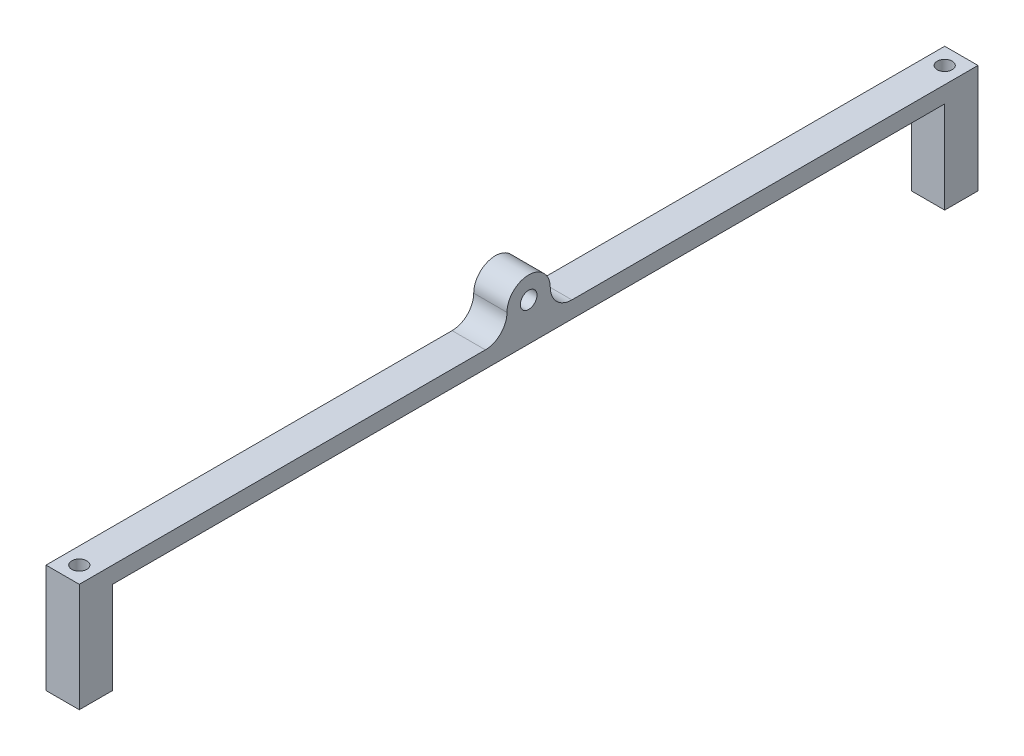
ISO-10303-21;
HEADER;
FILE_DESCRIPTION(('STEP AP214'),'2;1');
FILE_NAME('part.step','',(''),(''),'','','');
FILE_SCHEMA(('AUTOMOTIVE_DESIGN { 1 0 10303 214 1 1 1 1 }'));
ENDSEC;
DATA;
#1=APPLICATION_CONTEXT('core data for automotive mechanical design processes');
#2=APPLICATION_PROTOCOL_DEFINITION('international standard','automotive_design',2000,#1);
#3=PRODUCT_CONTEXT('',#1,'mechanical');
#4=PRODUCT('Part','Part','',(#3));
#5=PRODUCT_RELATED_PRODUCT_CATEGORY('part','',(#4));
#6=PRODUCT_DEFINITION_FORMATION('','',#4);
#7=PRODUCT_DEFINITION_CONTEXT('part definition',#1,'design');
#8=PRODUCT_DEFINITION('design','',#6,#7);
#9=PRODUCT_DEFINITION_SHAPE('','',#8);
#10=(LENGTH_UNIT() NAMED_UNIT(*) SI_UNIT(.MILLI.,.METRE.));
#11=(NAMED_UNIT(*) PLANE_ANGLE_UNIT() SI_UNIT($,.RADIAN.));
#12=(NAMED_UNIT(*) SI_UNIT($,.STERADIAN.) SOLID_ANGLE_UNIT());
#13=UNCERTAINTY_MEASURE_WITH_UNIT(LENGTH_MEASURE(1.E-05),#10,'distance_accuracy_value','');
#14=(GEOMETRIC_REPRESENTATION_CONTEXT(3) GLOBAL_UNCERTAINTY_ASSIGNED_CONTEXT((#13)) GLOBAL_UNIT_ASSIGNED_CONTEXT((#10,
#11,#12)) REPRESENTATION_CONTEXT('',''));
#15=CARTESIAN_POINT('',(0.,0.,0.));
#16=DIRECTION('',(0.,0.,1.));
#17=DIRECTION('',(1.,0.,0.));
#18=AXIS2_PLACEMENT_3D('',#15,#16,#17);
#19=CARTESIAN_POINT('',(0.,0.,0.));
#20=DIRECTION('',(0.,1.,0.));
#21=DIRECTION('',(0.,0.,1.));
#22=AXIS2_PLACEMENT_3D('',#19,#20,#21);
#23=PLANE('',#22);
#24=DIRECTION('',(1.,0.,0.));
#25=VECTOR('',#24,1.);
#26=CARTESIAN_POINT('',(0.,0.,-10.));
#27=LINE('',#26,#25);
#28=CARTESIAN_POINT('',(0.,0.,-10.));
#29=VERTEX_POINT('',#28);
#30=CARTESIAN_POINT('',(10.,0.,-10.));
#31=VERTEX_POINT('',#30);
#32=EDGE_CURVE('E61',#29,#31,#27,.T.);
#33=ORIENTED_EDGE('',*,*,#32,.F.);
#34=DIRECTION('',(0.,0.,1.));
#35=VECTOR('',#34,1.);
#36=CARTESIAN_POINT('',(0.,0.,-270.));
#37=LINE('',#36,#35);
#38=CARTESIAN_POINT('',(0.,0.,-260.));
#39=VERTEX_POINT('',#38);
#40=EDGE_CURVE('E130',#39,#29,#37,.T.);
#41=ORIENTED_EDGE('',*,*,#40,.F.);
#42=DIRECTION('',(-1.,0.,0.));
#43=VECTOR('',#42,1.);
#44=CARTESIAN_POINT('',(0.,0.,-260.));
#45=LINE('',#44,#43);
#46=CARTESIAN_POINT('',(10.,0.,-260.));
#47=VERTEX_POINT('',#46);
#48=EDGE_CURVE('E56',#47,#39,#45,.T.);
#49=ORIENTED_EDGE('',*,*,#48,.F.);
#50=DIRECTION('',(0.,0.,-1.));
#51=VECTOR('',#50,1.);
#52=CARTESIAN_POINT('',(10.,0.,-270.));
#53=LINE('',#52,#51);
#54=EDGE_CURVE('E125',#31,#47,#53,.T.);
#55=ORIENTED_EDGE('',*,*,#54,.F.);
#56=EDGE_LOOP('',(#33,#41,#49,#55));
#57=FACE_BOUND('',#56,.T.);
#58=ADVANCED_FACE('F41',(#57),#23,.F.);
#59=CARTESIAN_POINT('',(0.,5.,0.));
#60=DIRECTION('',(0.,1.,0.));
#61=DIRECTION('',(0.,0.,1.));
#62=AXIS2_PLACEMENT_3D('',#59,#60,#61);
#63=PLANE('',#62);
#64=CARTESIAN_POINT('',(4.99999999999999,5.,-5.));
#65=DIRECTION('',(0.,1.,0.));
#66=DIRECTION('',(0.,0.,1.));
#67=AXIS2_PLACEMENT_3D('',#64,#65,#66);
#68=CIRCLE('',#67,2.25000000000001);
#69=CARTESIAN_POINT('',(4.99999999999999,5.,-2.74999999999999));
#70=VERTEX_POINT('',#69);
#71=EDGE_CURVE('E210',#70,#70,#68,.T.);
#72=ORIENTED_EDGE('',*,*,#71,.F.);
#73=EDGE_LOOP('',(#72));
#74=FACE_BOUND('',#73,.T.);
#75=DIRECTION('',(0.,0.,-1.));
#76=VECTOR('',#75,1.);
#77=CARTESIAN_POINT('',(10.,5.,-270.));
#78=LINE('',#77,#76);
#79=CARTESIAN_POINT('',(10.,5.,0.));
#80=VERTEX_POINT('',#79);
#81=CARTESIAN_POINT('',(10.,5.,-122.));
#82=VERTEX_POINT('',#81);
#83=EDGE_CURVE('E221',#80,#82,#78,.T.);
#84=ORIENTED_EDGE('',*,*,#83,.T.);
#85=DIRECTION('',(-1.,0.,0.));
#86=VECTOR('',#85,1.);
#87=CARTESIAN_POINT('',(10.,5.,-122.));
#88=LINE('',#87,#86);
#89=CARTESIAN_POINT('',(0.,5.,-122.));
#90=VERTEX_POINT('',#89);
#91=EDGE_CURVE('E208',#82,#90,#88,.T.);
#92=ORIENTED_EDGE('',*,*,#91,.T.);
#93=DIRECTION('',(0.,0.,1.));
#94=VECTOR('',#93,1.);
#95=CARTESIAN_POINT('',(0.,5.,-270.));
#96=LINE('',#95,#94);
#97=CARTESIAN_POINT('',(0.,5.,0.));
#98=VERTEX_POINT('',#97);
#99=EDGE_CURVE('E129',#90,#98,#96,.T.);
#100=ORIENTED_EDGE('',*,*,#99,.T.);
#101=DIRECTION('',(1.,0.,0.));
#102=VECTOR('',#101,1.);
#103=CARTESIAN_POINT('',(0.,5.,0.));
#104=LINE('',#103,#102);
#105=EDGE_CURVE('E218',#98,#80,#104,.T.);
#106=ORIENTED_EDGE('',*,*,#105,.T.);
#107=EDGE_LOOP('',(#84,#92,#100,#106));
#108=FACE_BOUND('',#107,.T.);
#109=ADVANCED_FACE('F276',(#74,#108),#63,.T.);
#110=DIRECTION('',(-1.,0.,0.));
#111=VECTOR('',#110,1.);
#112=CARTESIAN_POINT('',(10.,4.99999999999998,-148.));
#113=LINE('',#112,#111);
#114=CARTESIAN_POINT('',(10.,4.99999999999998,-148.));
#115=VERTEX_POINT('',#114);
#116=CARTESIAN_POINT('',(0.,5.,-148.));
#117=VERTEX_POINT('',#116);
#118=EDGE_CURVE('E205',#115,#117,#113,.T.);
#119=ORIENTED_EDGE('',*,*,#118,.F.);
#120=CARTESIAN_POINT('',(10.,5.,-270.));
#121=VERTEX_POINT('',#120);
#122=EDGE_CURVE('E220',#115,#121,#78,.T.);
#123=ORIENTED_EDGE('',*,*,#122,.T.);
#124=DIRECTION('',(-1.,0.,0.));
#125=VECTOR('',#124,1.);
#126=CARTESIAN_POINT('',(0.,5.,-270.));
#127=LINE('',#126,#125);
#128=CARTESIAN_POINT('',(0.,5.,-270.));
#129=VERTEX_POINT('',#128);
#130=EDGE_CURVE('E223',#121,#129,#127,.T.);
#131=ORIENTED_EDGE('',*,*,#130,.T.);
#132=EDGE_CURVE('E216',#129,#117,#96,.T.);
#133=ORIENTED_EDGE('',*,*,#132,.T.);
#134=EDGE_LOOP('',(#119,#123,#131,#133));
#135=FACE_BOUND('',#134,.T.);
#136=CARTESIAN_POINT('',(4.99999999999998,5.,-265.));
#137=DIRECTION('',(0.,1.,0.));
#138=DIRECTION('',(0.,0.,1.));
#139=AXIS2_PLACEMENT_3D('',#136,#137,#138);
#140=CIRCLE('',#139,2.24999999999983);
#141=CARTESIAN_POINT('',(4.99999999999998,5.,-262.75));
#142=VERTEX_POINT('',#141);
#143=EDGE_CURVE('E213',#142,#142,#140,.T.);
#144=ORIENTED_EDGE('',*,*,#143,.F.);
#145=EDGE_LOOP('',(#144));
#146=FACE_BOUND('',#145,.T.);
#147=ADVANCED_FACE('F259',(#135,#146),#63,.T.);
#148=CARTESIAN_POINT('',(0.,5.,-270.));
#149=DIRECTION('',(1.,0.,0.));
#150=DIRECTION('',(0.,0.,-1.));
#151=AXIS2_PLACEMENT_3D('',#148,#149,#150);
#152=PLANE('',#151);
#153=DIRECTION('',(0.,-1.,0.));
#154=VECTOR('',#153,1.);
#155=CARTESIAN_POINT('',(0.,5.,-270.));
#156=LINE('',#155,#154);
#157=CARTESIAN_POINT('',(0.,-27.6499999999995,-270.));
#158=VERTEX_POINT('',#157);
#159=EDGE_CURVE('E225',#129,#158,#156,.T.);
#160=ORIENTED_EDGE('',*,*,#159,.T.);
#161=DIRECTION('',(0.,0.,-1.));
#162=VECTOR('',#161,1.);
#163=CARTESIAN_POINT('',(0.,-27.6499999999995,-270.));
#164=LINE('',#163,#162);
#165=CARTESIAN_POINT('',(0.,-27.6499999999995,-260.));
#166=VERTEX_POINT('',#165);
#167=EDGE_CURVE('E168',#166,#158,#164,.T.);
#168=ORIENTED_EDGE('',*,*,#167,.F.);
#169=DIRECTION('',(0.,1.,0.));
#170=VECTOR('',#169,1.);
#171=CARTESIAN_POINT('',(0.,-41.7921356237305,-260.));
#172=LINE('',#171,#170);
#173=EDGE_CURVE('E164',#166,#39,#172,.T.);
#174=ORIENTED_EDGE('',*,*,#173,.T.);
#175=ORIENTED_EDGE('',*,*,#40,.T.);
#176=DIRECTION('',(0.,1.,0.));
#177=VECTOR('',#176,1.);
#178=CARTESIAN_POINT('',(0.,-41.7921356237305,-10.));
#179=LINE('',#178,#177);
#180=CARTESIAN_POINT('',(0.,-27.6499999999995,-10.));
#181=VERTEX_POINT('',#180);
#182=EDGE_CURVE('E141',#181,#29,#179,.T.);
#183=ORIENTED_EDGE('',*,*,#182,.F.);
#184=DIRECTION('',(0.,0.,-1.));
#185=VECTOR('',#184,1.);
#186=CARTESIAN_POINT('',(0.,-27.6499999999995,0.));
#187=LINE('',#186,#185);
#188=CARTESIAN_POINT('',(0.,-27.6499999999995,0.));
#189=VERTEX_POINT('',#188);
#190=EDGE_CURVE('E160',#189,#181,#187,.T.);
#191=ORIENTED_EDGE('',*,*,#190,.F.);
#192=DIRECTION('',(0.,-1.,0.));
#193=VECTOR('',#192,1.);
#194=CARTESIAN_POINT('',(0.,5.,0.));
#195=LINE('',#194,#193);
#196=EDGE_CURVE('E11',#98,#189,#195,.T.);
#197=ORIENTED_EDGE('',*,*,#196,.F.);
#198=ORIENTED_EDGE('',*,*,#99,.F.);
#199=CARTESIAN_POINT('',(0.,11.5,-122.));
#200=DIRECTION('',(-1.,0.,0.));
#201=DIRECTION('',(0.,0.,-1.));
#202=AXIS2_PLACEMENT_3D('',#199,#200,#201);
#203=CIRCLE('',#202,6.50000000000002);
#204=CARTESIAN_POINT('',(0.,11.5,-128.5));
#205=VERTEX_POINT('',#204);
#206=EDGE_CURVE('E182',#205,#90,#203,.T.);
#207=ORIENTED_EDGE('',*,*,#206,.F.);
#208=CARTESIAN_POINT('',(0.,11.5,-135.));
#209=DIRECTION('',(1.,0.,0.));
#210=DIRECTION('',(0.,0.,-1.));
#211=AXIS2_PLACEMENT_3D('',#208,#209,#210);
#212=CIRCLE('',#211,6.49999999999999);
#213=CARTESIAN_POINT('',(0.,11.5,-141.5));
#214=VERTEX_POINT('',#213);
#215=EDGE_CURVE('E190',#214,#205,#212,.T.);
#216=ORIENTED_EDGE('',*,*,#215,.F.);
#217=CARTESIAN_POINT('',(0.,11.5,-148.));
#218=DIRECTION('',(-1.,0.,0.));
#219=DIRECTION('',(0.,0.,-1.));
#220=AXIS2_PLACEMENT_3D('',#217,#218,#219);
#221=CIRCLE('',#220,6.5);
#222=EDGE_CURVE('E197',#117,#214,#221,.T.);
#223=ORIENTED_EDGE('',*,*,#222,.F.);
#224=ORIENTED_EDGE('',*,*,#132,.F.);
#225=EDGE_LOOP('',(#160,#168,#174,#175,#183,#191,#197,#198,#207,#216,#223,#224));
#226=FACE_BOUND('',#225,.T.);
#227=CARTESIAN_POINT('',(0.,11.5,-135.));
#228=DIRECTION('',(1.,0.,0.));
#229=DIRECTION('',(0.,0.,-1.));
#230=AXIS2_PLACEMENT_3D('',#227,#228,#229);
#231=CIRCLE('',#230,2.5000000000002);
#232=CARTESIAN_POINT('',(0.,11.5,-137.5));
#233=VERTEX_POINT('',#232);
#234=EDGE_CURVE('E183',#233,#233,#231,.T.);
#235=ORIENTED_EDGE('',*,*,#234,.T.);
#236=EDGE_LOOP('',(#235));
#237=FACE_BOUND('',#236,.T.);
#238=ADVANCED_FACE('F43',(#226,#237),#152,.F.);
#239=CARTESIAN_POINT('',(0.,5.,0.));
#240=DIRECTION('',(0.,0.,-1.));
#241=DIRECTION('',(-1.,0.,0.));
#242=AXIS2_PLACEMENT_3D('',#239,#240,#241);
#243=PLANE('',#242);
#244=ORIENTED_EDGE('',*,*,#196,.T.);
#245=DIRECTION('',(-1.,0.,0.));
#246=VECTOR('',#245,1.);
#247=CARTESIAN_POINT('',(0.,-27.6499999999995,0.));
#248=LINE('',#247,#246);
#249=CARTESIAN_POINT('',(10.,-27.6499999999995,0.));
#250=VERTEX_POINT('',#249);
#251=EDGE_CURVE('E156',#250,#189,#248,.T.);
#252=ORIENTED_EDGE('',*,*,#251,.F.);
#253=DIRECTION('',(0.,-1.,0.));
#254=VECTOR('',#253,1.);
#255=CARTESIAN_POINT('',(10.,5.,0.));
#256=LINE('',#255,#254);
#257=EDGE_CURVE('E49',#80,#250,#256,.T.);
#258=ORIENTED_EDGE('',*,*,#257,.F.);
#259=ORIENTED_EDGE('',*,*,#105,.F.);
#260=EDGE_LOOP('',(#244,#252,#258,#259));
#261=FACE_BOUND('',#260,.T.);
#262=ADVANCED_FACE('F237',(#261),#243,.F.);
#263=CARTESIAN_POINT('',(10.,5.,-270.));
#264=DIRECTION('',(-1.,0.,0.));
#265=DIRECTION('',(0.,0.,1.));
#266=AXIS2_PLACEMENT_3D('',#263,#264,#265);
#267=PLANE('',#266);
#268=ORIENTED_EDGE('',*,*,#257,.T.);
#269=DIRECTION('',(0.,0.,1.));
#270=VECTOR('',#269,1.);
#271=CARTESIAN_POINT('',(10.,-27.6499999999995,0.));
#272=LINE('',#271,#270);
#273=CARTESIAN_POINT('',(10.,-27.6499999999995,-10.));
#274=VERTEX_POINT('',#273);
#275=EDGE_CURVE('E138',#274,#250,#272,.T.);
#276=ORIENTED_EDGE('',*,*,#275,.F.);
#277=DIRECTION('',(0.,1.,0.));
#278=VECTOR('',#277,1.);
#279=CARTESIAN_POINT('',(10.,-41.7921356237305,-10.));
#280=LINE('',#279,#278);
#281=EDGE_CURVE('E134',#274,#31,#280,.T.);
#282=ORIENTED_EDGE('',*,*,#281,.T.);
#283=ORIENTED_EDGE('',*,*,#54,.T.);
#284=DIRECTION('',(0.,1.,0.));
#285=VECTOR('',#284,1.);
#286=CARTESIAN_POINT('',(10.,-41.7921356237305,-260.));
#287=LINE('',#286,#285);
#288=CARTESIAN_POINT('',(10.,-27.6499999999995,-260.));
#289=VERTEX_POINT('',#288);
#290=EDGE_CURVE('E162',#289,#47,#287,.T.);
#291=ORIENTED_EDGE('',*,*,#290,.F.);
#292=DIRECTION('',(0.,0.,1.));
#293=VECTOR('',#292,1.);
#294=CARTESIAN_POINT('',(10.,-27.6499999999996,-270.));
#295=LINE('',#294,#293);
#296=CARTESIAN_POINT('',(10.,-27.6499999999996,-270.));
#297=VERTEX_POINT('',#296);
#298=EDGE_CURVE('E174',#297,#289,#295,.T.);
#299=ORIENTED_EDGE('',*,*,#298,.F.);
#300=DIRECTION('',(0.,-1.,0.));
#301=VECTOR('',#300,1.);
#302=CARTESIAN_POINT('',(10.,5.,-270.));
#303=LINE('',#302,#301);
#304=EDGE_CURVE('E228',#121,#297,#303,.T.);
#305=ORIENTED_EDGE('',*,*,#304,.F.);
#306=ORIENTED_EDGE('',*,*,#122,.F.);
#307=CARTESIAN_POINT('',(10.,11.5,-148.));
#308=DIRECTION('',(-1.,0.,0.));
#309=DIRECTION('',(0.,0.,-1.));
#310=AXIS2_PLACEMENT_3D('',#307,#308,#309);
#311=CIRCLE('',#310,6.5);
#312=CARTESIAN_POINT('',(10.,11.5,-141.5));
#313=VERTEX_POINT('',#312);
#314=EDGE_CURVE('E189',#115,#313,#311,.T.);
#315=ORIENTED_EDGE('',*,*,#314,.T.);
#316=CARTESIAN_POINT('',(10.,11.5,-135.));
#317=DIRECTION('',(1.,0.,0.));
#318=DIRECTION('',(0.,0.,-1.));
#319=AXIS2_PLACEMENT_3D('',#316,#317,#318);
#320=CIRCLE('',#319,6.49999999999999);
#321=CARTESIAN_POINT('',(10.,11.5,-128.5));
#322=VERTEX_POINT('',#321);
#323=EDGE_CURVE('E192',#313,#322,#320,.T.);
#324=ORIENTED_EDGE('',*,*,#323,.T.);
#325=CARTESIAN_POINT('',(10.,11.5,-122.));
#326=DIRECTION('',(-1.,0.,0.));
#327=DIRECTION('',(0.,0.,-1.));
#328=AXIS2_PLACEMENT_3D('',#325,#326,#327);
#329=CIRCLE('',#328,6.50000000000002);
#330=EDGE_CURVE('E186',#322,#82,#329,.T.);
#331=ORIENTED_EDGE('',*,*,#330,.T.);
#332=ORIENTED_EDGE('',*,*,#83,.F.);
#333=EDGE_LOOP('',(#268,#276,#282,#283,#291,#299,#305,#306,#315,#324,#331,#332));
#334=FACE_BOUND('',#333,.T.);
#335=CARTESIAN_POINT('',(10.,11.5,-135.));
#336=DIRECTION('',(1.,0.,0.));
#337=DIRECTION('',(0.,0.,-1.));
#338=AXIS2_PLACEMENT_3D('',#335,#336,#337);
#339=CIRCLE('',#338,2.5000000000002);
#340=CARTESIAN_POINT('',(10.,11.5,-137.5));
#341=VERTEX_POINT('',#340);
#342=EDGE_CURVE('E179',#341,#341,#339,.T.);
#343=ORIENTED_EDGE('',*,*,#342,.F.);
#344=EDGE_LOOP('',(#343));
#345=FACE_BOUND('',#344,.T.);
#346=ADVANCED_FACE('F135',(#334,#345),#267,.F.);
#347=CARTESIAN_POINT('',(0.,5.,-270.));
#348=DIRECTION('',(0.,0.,1.));
#349=DIRECTION('',(1.,0.,0.));
#350=AXIS2_PLACEMENT_3D('',#347,#348,#349);
#351=PLANE('',#350);
#352=ORIENTED_EDGE('',*,*,#304,.T.);
#353=DIRECTION('',(1.,0.,0.));
#354=VECTOR('',#353,1.);
#355=CARTESIAN_POINT('',(0.,-27.6499999999995,-270.));
#356=LINE('',#355,#354);
#357=EDGE_CURVE('E171',#158,#297,#356,.T.);
#358=ORIENTED_EDGE('',*,*,#357,.F.);
#359=ORIENTED_EDGE('',*,*,#159,.F.);
#360=ORIENTED_EDGE('',*,*,#130,.F.);
#361=EDGE_LOOP('',(#352,#358,#359,#360));
#362=FACE_BOUND('',#361,.T.);
#363=ADVANCED_FACE('F255',(#362),#351,.F.);
#364=CARTESIAN_POINT('',(4.99999999999998,5.,-265.));
#365=DIRECTION('',(0.,-1.,0.));
#366=DIRECTION('',(0.,0.,-1.));
#367=AXIS2_PLACEMENT_3D('',#364,#365,#366);
#368=CYLINDRICAL_SURFACE('',#367,2.24999999999983);
#369=ORIENTED_EDGE('',*,*,#143,.T.);
#370=EDGE_LOOP('',(#369));
#371=FACE_BOUND('',#370,.T.);
#372=CARTESIAN_POINT('',(4.99999999999998,-27.6499999999995,-265.));
#373=DIRECTION('',(0.,-1.,0.));
#374=DIRECTION('',(1.,0.,0.));
#375=AXIS2_PLACEMENT_3D('',#372,#373,#374);
#376=CIRCLE('',#375,2.24999999999983);
#377=CARTESIAN_POINT('',(7.2499999999998,-27.6499999999996,-265.));
#378=VERTEX_POINT('',#377);
#379=EDGE_CURVE('E146',#378,#378,#376,.T.);
#380=ORIENTED_EDGE('',*,*,#379,.T.);
#381=EDGE_LOOP('',(#380));
#382=FACE_BOUND('',#381,.T.);
#383=ADVANCED_FACE('F287',(#371,#382),#368,.F.);
#384=CARTESIAN_POINT('',(4.99999999999999,5.,-5.));
#385=DIRECTION('',(0.,-1.,0.));
#386=DIRECTION('',(0.,0.,-1.));
#387=AXIS2_PLACEMENT_3D('',#384,#385,#386);
#388=CYLINDRICAL_SURFACE('',#387,2.25000000000001);
#389=ORIENTED_EDGE('',*,*,#71,.T.);
#390=EDGE_LOOP('',(#389));
#391=FACE_BOUND('',#390,.T.);
#392=CARTESIAN_POINT('',(5.,-27.6499999999995,-5.));
#393=DIRECTION('',(0.,1.,0.));
#394=DIRECTION('',(0.,0.,1.));
#395=AXIS2_PLACEMENT_3D('',#392,#393,#394);
#396=CIRCLE('',#395,2.25000000000001);
#397=CARTESIAN_POINT('',(5.00000000000001,-27.6499999999995,-2.74999999999999));
#398=VERTEX_POINT('',#397);
#399=EDGE_CURVE('E159',#398,#398,#396,.T.);
#400=ORIENTED_EDGE('',*,*,#399,.F.);
#401=EDGE_LOOP('',(#400));
#402=FACE_BOUND('',#401,.T.);
#403=ADVANCED_FACE('F333',(#391,#402),#388,.F.);
#404=CARTESIAN_POINT('',(10.,11.5,-122.));
#405=DIRECTION('',(-1.,0.,0.));
#406=DIRECTION('',(0.,0.,1.));
#407=AXIS2_PLACEMENT_3D('',#404,#405,#406);
#408=CYLINDRICAL_SURFACE('',#407,6.50000000000002);
#409=ORIENTED_EDGE('',*,*,#206,.T.);
#410=ORIENTED_EDGE('',*,*,#91,.F.);
#411=ORIENTED_EDGE('',*,*,#330,.F.);
#412=DIRECTION('',(-1.,0.,0.));
#413=VECTOR('',#412,1.);
#414=CARTESIAN_POINT('',(10.,11.5,-128.5));
#415=LINE('',#414,#413);
#416=EDGE_CURVE('E194',#322,#205,#415,.T.);
#417=ORIENTED_EDGE('',*,*,#416,.T.);
#418=EDGE_LOOP('',(#409,#410,#411,#417));
#419=FACE_BOUND('',#418,.T.);
#420=ADVANCED_FACE('F274',(#419),#408,.F.);
#421=CARTESIAN_POINT('',(10.,11.5,-148.));
#422=DIRECTION('',(-1.,0.,0.));
#423=DIRECTION('',(0.,0.,1.));
#424=AXIS2_PLACEMENT_3D('',#421,#422,#423);
#425=CYLINDRICAL_SURFACE('',#424,6.5);
#426=ORIENTED_EDGE('',*,*,#222,.T.);
#427=DIRECTION('',(-1.,0.,0.));
#428=VECTOR('',#427,1.);
#429=CARTESIAN_POINT('',(10.,11.5,-141.5));
#430=LINE('',#429,#428);
#431=EDGE_CURVE('E202',#313,#214,#430,.T.);
#432=ORIENTED_EDGE('',*,*,#431,.F.);
#433=ORIENTED_EDGE('',*,*,#314,.F.);
#434=ORIENTED_EDGE('',*,*,#118,.T.);
#435=EDGE_LOOP('',(#426,#432,#433,#434));
#436=FACE_BOUND('',#435,.T.);
#437=ADVANCED_FACE('F266',(#436),#425,.F.);
#438=CARTESIAN_POINT('',(10.,11.5,-135.));
#439=DIRECTION('',(-1.,0.,0.));
#440=DIRECTION('',(0.,0.,1.));
#441=AXIS2_PLACEMENT_3D('',#438,#439,#440);
#442=CYLINDRICAL_SURFACE('',#441,6.49999999999999);
#443=ORIENTED_EDGE('',*,*,#215,.T.);
#444=ORIENTED_EDGE('',*,*,#416,.F.);
#445=ORIENTED_EDGE('',*,*,#323,.F.);
#446=ORIENTED_EDGE('',*,*,#431,.T.);
#447=EDGE_LOOP('',(#443,#444,#445,#446));
#448=FACE_BOUND('',#447,.T.);
#449=ADVANCED_FACE('F270',(#448),#442,.T.);
#450=CARTESIAN_POINT('',(10.,11.5,-135.));
#451=DIRECTION('',(-1.,0.,0.));
#452=DIRECTION('',(0.,0.,1.));
#453=AXIS2_PLACEMENT_3D('',#450,#451,#452);
#454=CYLINDRICAL_SURFACE('',#453,2.5000000000002);
#455=ORIENTED_EDGE('',*,*,#342,.T.);
#456=EDGE_LOOP('',(#455));
#457=FACE_BOUND('',#456,.T.);
#458=ORIENTED_EDGE('',*,*,#234,.F.);
#459=EDGE_LOOP('',(#458));
#460=FACE_BOUND('',#459,.T.);
#461=ADVANCED_FACE('F309',(#457,#460),#454,.F.);
#462=CARTESIAN_POINT('',(0.,-41.7921356237305,-260.));
#463=DIRECTION('',(0.,0.,-1.));
#464=DIRECTION('',(-1.,0.,0.));
#465=AXIS2_PLACEMENT_3D('',#462,#463,#464);
#466=PLANE('',#465);
#467=DIRECTION('',(-1.,0.,0.));
#468=VECTOR('',#467,1.);
#469=CARTESIAN_POINT('',(0.,-27.6499999999995,-260.));
#470=LINE('',#469,#468);
#471=EDGE_CURVE('E149',#289,#166,#470,.T.);
#472=ORIENTED_EDGE('',*,*,#471,.F.);
#473=ORIENTED_EDGE('',*,*,#290,.T.);
#474=ORIENTED_EDGE('',*,*,#48,.T.);
#475=ORIENTED_EDGE('',*,*,#173,.F.);
#476=EDGE_LOOP('',(#472,#473,#474,#475));
#477=FACE_BOUND('',#476,.T.);
#478=ADVANCED_FACE('F246',(#477),#466,.F.);
#479=CARTESIAN_POINT('',(292.3,-27.65,77.9215081014157));
#480=DIRECTION('',(0.,-1.,0.));
#481=DIRECTION('',(0.,0.,-1.));
#482=AXIS2_PLACEMENT_3D('',#479,#480,#481);
#483=PLANE('',#482);
#484=ORIENTED_EDGE('',*,*,#379,.F.);
#485=EDGE_LOOP('',(#484));
#486=FACE_BOUND('',#485,.T.);
#487=ORIENTED_EDGE('',*,*,#471,.T.);
#488=ORIENTED_EDGE('',*,*,#167,.T.);
#489=ORIENTED_EDGE('',*,*,#357,.T.);
#490=ORIENTED_EDGE('',*,*,#298,.T.);
#491=EDGE_LOOP('',(#487,#488,#489,#490));
#492=FACE_BOUND('',#491,.T.);
#493=ADVANCED_FACE('F252',(#486,#492),#483,.T.);
#494=CARTESIAN_POINT('',(0.,-41.7921356237305,-10.));
#495=DIRECTION('',(0.,0.,1.));
#496=DIRECTION('',(1.,0.,0.));
#497=AXIS2_PLACEMENT_3D('',#494,#495,#496);
#498=PLANE('',#497);
#499=DIRECTION('',(1.,0.,0.));
#500=VECTOR('',#499,1.);
#501=CARTESIAN_POINT('',(0.,-27.6499999999995,-10.));
#502=LINE('',#501,#500);
#503=EDGE_CURVE('E152',#181,#274,#502,.T.);
#504=ORIENTED_EDGE('',*,*,#503,.F.);
#505=ORIENTED_EDGE('',*,*,#182,.T.);
#506=ORIENTED_EDGE('',*,*,#32,.T.);
#507=ORIENTED_EDGE('',*,*,#281,.F.);
#508=EDGE_LOOP('',(#504,#505,#506,#507));
#509=FACE_BOUND('',#508,.T.);
#510=ADVANCED_FACE('F144',(#509),#498,.F.);
#511=CARTESIAN_POINT('',(292.3,-27.65,77.9215081014157));
#512=DIRECTION('',(0.,-1.,0.));
#513=DIRECTION('',(0.,0.,-1.));
#514=AXIS2_PLACEMENT_3D('',#511,#512,#513);
#515=PLANE('',#514);
#516=ORIENTED_EDGE('',*,*,#399,.T.);
#517=EDGE_LOOP('',(#516));
#518=FACE_BOUND('',#517,.T.);
#519=ORIENTED_EDGE('',*,*,#503,.T.);
#520=ORIENTED_EDGE('',*,*,#275,.T.);
#521=ORIENTED_EDGE('',*,*,#251,.T.);
#522=ORIENTED_EDGE('',*,*,#190,.T.);
#523=EDGE_LOOP('',(#519,#520,#521,#522));
#524=FACE_BOUND('',#523,.T.);
#525=ADVANCED_FACE('F235',(#518,#524),#515,.T.);
#526=CLOSED_SHELL('',(#58,#109,#147,#238,#262,#346,#363,#383,#403,#420,#437,#449,#461,#478,#493,
#510,#525));
#527=MANIFOLD_SOLID_BREP('B2',#526);
#528=ADVANCED_BREP_SHAPE_REPRESENTATION('',(#18,#527),#14);
#529=SHAPE_DEFINITION_REPRESENTATION(#9,#528);
ENDSEC;
END-ISO-10303-21;
